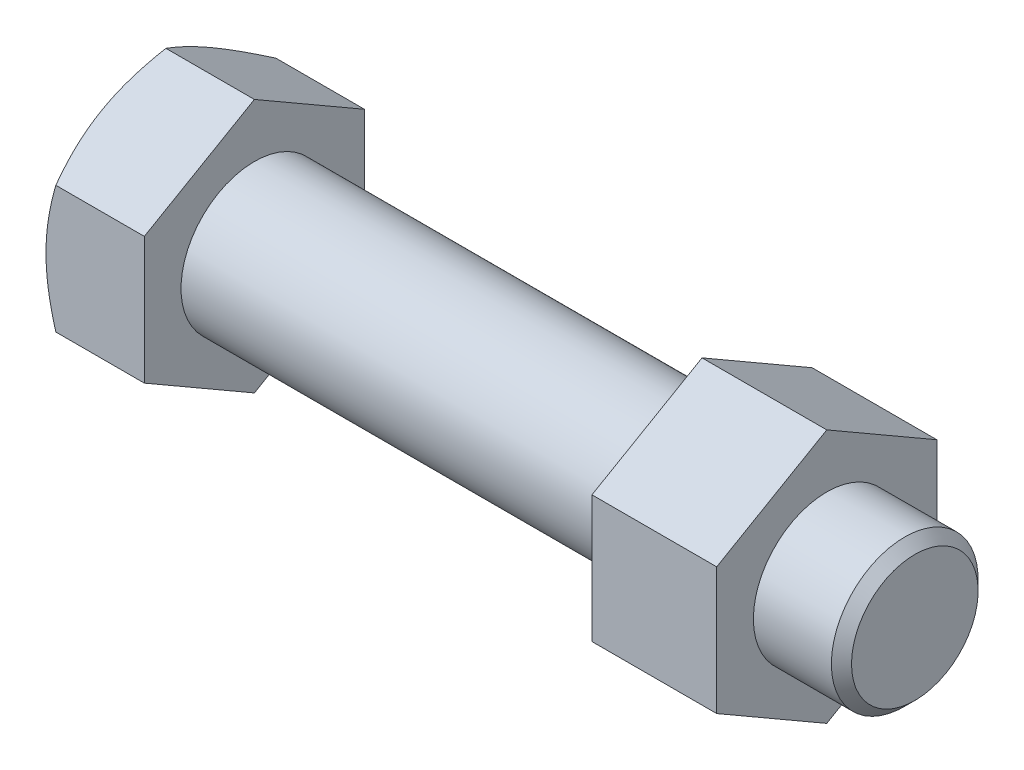
ISO-10303-21;
HEADER;
FILE_DESCRIPTION(('STEP AP214'),'2;1');
FILE_NAME('part.step','',(''),(''),'','','');
FILE_SCHEMA(('AUTOMOTIVE_DESIGN { 1 0 10303 214 1 1 1 1 }'));
ENDSEC;
DATA;
#1=APPLICATION_CONTEXT('core data for automotive mechanical design processes');
#2=APPLICATION_PROTOCOL_DEFINITION('international standard','automotive_design',2000,#1);
#3=PRODUCT_CONTEXT('',#1,'mechanical');
#4=PRODUCT('Part','Part','',(#3));
#5=PRODUCT_RELATED_PRODUCT_CATEGORY('part','',(#4));
#6=PRODUCT_DEFINITION_FORMATION('','',#4);
#7=PRODUCT_DEFINITION_CONTEXT('part definition',#1,'design');
#8=PRODUCT_DEFINITION('design','',#6,#7);
#9=PRODUCT_DEFINITION_SHAPE('','',#8);
#10=(LENGTH_UNIT() NAMED_UNIT(*) SI_UNIT(.MILLI.,.METRE.));
#11=(NAMED_UNIT(*) PLANE_ANGLE_UNIT() SI_UNIT($,.RADIAN.));
#12=(NAMED_UNIT(*) SI_UNIT($,.STERADIAN.) SOLID_ANGLE_UNIT());
#13=UNCERTAINTY_MEASURE_WITH_UNIT(LENGTH_MEASURE(1.E-05),#10,'distance_accuracy_value','');
#14=(GEOMETRIC_REPRESENTATION_CONTEXT(3) GLOBAL_UNCERTAINTY_ASSIGNED_CONTEXT((#13)) GLOBAL_UNIT_ASSIGNED_CONTEXT((#10,
#11,#12)) REPRESENTATION_CONTEXT('',''));
#15=CARTESIAN_POINT('',(0.,0.,0.));
#16=DIRECTION('',(0.,0.,1.));
#17=DIRECTION('',(1.,0.,0.));
#18=AXIS2_PLACEMENT_3D('',#15,#16,#17);
#19=CARTESIAN_POINT('',(0.,0.,0.));
#20=DIRECTION('',(-1.00000000000002,0.,0.));
#21=DIRECTION('',(0.,0.,1.));
#22=AXIS2_PLACEMENT_3D('',#19,#20,#21);
#23=CYLINDRICAL_SURFACE('',#22,10.);
#24=CARTESIAN_POINT('',(13.3999999999999,0.,0.));
#25=DIRECTION('',(1.00000000000002,0.,0.));
#26=DIRECTION('',(0.,0.,-1.));
#27=AXIS2_PLACEMENT_3D('',#24,#25,#26);
#28=CIRCLE('',#27,10.);
#29=CARTESIAN_POINT('',(13.3999999999999,0.,-10.));
#30=VERTEX_POINT('',#29);
#31=EDGE_CURVE('E280',#30,#30,#28,.F.);
#32=ORIENTED_EDGE('',*,*,#31,.F.);
#33=EDGE_LOOP('',(#32));
#34=FACE_BOUND('',#33,.T.);
#35=CARTESIAN_POINT('',(74.4000000000012,-2.77555756156289E-13,-8.88178419700125E-13));
#36=DIRECTION('',(1.00000000000002,0.,0.));
#37=DIRECTION('',(0.,0.,-1.));
#38=AXIS2_PLACEMENT_3D('',#35,#36,#37);
#39=CIRCLE('',#38,10.);
#40=CARTESIAN_POINT('',(74.4000000000012,-2.77555756156289E-13,-10.0000000000009));
#41=VERTEX_POINT('',#40);
#42=EDGE_CURVE('E11',#41,#41,#39,.T.);
#43=ORIENTED_EDGE('',*,*,#42,.F.);
#44=EDGE_LOOP('',(#43));
#45=FACE_BOUND('',#44,.T.);
#46=ADVANCED_FACE('F38',(#34,#45),#23,.T.);
#47=CARTESIAN_POINT('',(13.4,8.66025403784412,-15.));
#48=DIRECTION('',(0.,-0.866025403784452,0.500000000000001));
#49=DIRECTION('',(0.,-0.500000000000009,-0.866025403784439));
#50=AXIS2_PLACEMENT_3D('',#47,#48,#49);
#51=PLANE('',#50);
#52=CARTESIAN_POINT('',(1.33981262948873,17.3206235457428,0.00019999999800735));
#53=CARTESIAN_POINT('',(1.22992178974348,17.1302745659124,-0.329494104235239));
#54=CARTESIAN_POINT('',(1.12501758932805,16.9391831227811,-0.660474192629516));
#55=CARTESIAN_POINT('',(0.926568581942497,16.555467907948,-1.32508844035708));
#56=CARTESIAN_POINT('',(0.833027511048935,16.3628436543351,-1.65872343438493));
#57=CARTESIAN_POINT('',(0.65856214760936,15.9756905506614,-2.32929228025591));
#58=CARTESIAN_POINT('',(0.577667706601698,15.7811583127501,-2.66623200002818));
#59=CARTESIAN_POINT('',(0.430232643421587,15.3907420734243,-3.34245276264056));
#60=CARTESIAN_POINT('',(0.363691202380892,15.1948581497844,-3.6817336707707));
#61=CARTESIAN_POINT('',(0.247792374695921,14.8067578304056,-4.3539431423685));
#62=CARTESIAN_POINT('',(0.198051383436304,14.6145702475678,-4.68682180042751));
#63=CARTESIAN_POINT('',(0.114646749003283,14.2293144416645,-5.3541044301629));
#64=CARTESIAN_POINT('',(0.0809834152897755,14.0362462017207,-5.68850843107375));
#65=CARTESIAN_POINT('',(0.0305840757078476,13.6497853945781,-6.35787818417828));
#66=CARTESIAN_POINT('',(0.0138279549578747,13.4563934876185,-6.69284279280431));
#67=CARTESIAN_POINT('',(-0.00239660617324882,13.0694311550718,-7.36308121339242));
#68=CARTESIAN_POINT('',(-0.00186558072791873,12.8758607351856,-7.69835501548029));
#69=CARTESIAN_POINT('',(0.0152766129978911,12.5139822792563,-8.32514688731409));
#70=CARTESIAN_POINT('',(0.0297968460488745,12.3456484541469,-8.61670962503368));
#71=CARTESIAN_POINT('',(0.0716371404223871,12.0093680110849,-9.19916443800721));
#72=CARTESIAN_POINT('',(0.098958107109431,11.8414214213649,-9.49005646436071));
#73=CARTESIAN_POINT('',(0.165923511998852,11.5060066717816,-10.0710118522474));
#74=CARTESIAN_POINT('',(0.205578128270624,11.3385390227663,-10.3610743289659));
#75=CARTESIAN_POINT('',(0.296515103017877,11.0043888432036,-10.9398394173266));
#76=CARTESIAN_POINT('',(0.34779825196923,10.8377063668168,-11.2285419351601));
#77=CARTESIAN_POINT('',(0.520386864747077,10.3317324659526,-12.1049144387608));
#78=CARTESIAN_POINT('',(0.658901178256902,9.99390625558979,-12.6900465992375));
#79=CARTESIAN_POINT('',(0.973271968475103,9.3232912218448,-13.8515859100034));
#80=CARTESIAN_POINT('',(1.14905461461768,8.99049381241376,-14.4280079317654));
#81=CARTESIAN_POINT('',(1.33981262948857,8.66013856779058,-15.0002));
#82=B_SPLINE_CURVE_WITH_KNOTS('',3,(#52,#53,#54,#55,#56,#57,#58,#59,#60,#61,#62,#63,#64,#65,#66,
#67,#68,#69,#70,#71,#72,#73,#74,#75,#76,#77,#78,#79,#80,#81),.UNSPECIFIED.,.F.,.F.,(4,2,2,2,2,2,
2,2,2,2,2,2,2,2,4),(0.,1.18875411504163,2.37789802800057,3.56980778300395,4.76164951910137,
5.92407379683758,7.08652044780811,8.24758247406076,9.40860862348372,10.4193068498564,
11.4300765712307,12.4416826308647,13.45335747734,15.5211962051173,17.5849760846225),.UNSPECIFIED.);
#83=CARTESIAN_POINT('',(1.3397459621553,17.320508075689,-1.99840144432528E-12));
#84=VERTEX_POINT('',#83);
#85=CARTESIAN_POINT('',(-2.77555756156289E-13,12.9903810567667,-7.50000000000195));
#86=VERTEX_POINT('',#85);
#87=EDGE_CURVE('E55',#84,#86,#82,.T.);
#88=ORIENTED_EDGE('',*,*,#87,.F.);
#89=DIRECTION('',(-1.00000000000002,0.,0.));
#90=VECTOR('',#89,1.);
#91=CARTESIAN_POINT('',(13.4000000000001,17.3205080756892,-8.88178419700125E-13));
#92=LINE('',#91,#90);
#93=CARTESIAN_POINT('',(13.4000000000001,17.3205080756892,-8.88178419700125E-13));
#94=VERTEX_POINT('',#93);
#95=EDGE_CURVE('E316',#94,#84,#92,.T.);
#96=ORIENTED_EDGE('',*,*,#95,.F.);
#97=DIRECTION('',(0.,0.500000000000009,0.866025403784439));
#98=VECTOR('',#97,1.);
#99=CARTESIAN_POINT('',(13.4,8.66025403784412,-15.));
#100=LINE('',#99,#98);
#101=CARTESIAN_POINT('',(13.4,8.66025403784412,-15.));
#102=VERTEX_POINT('',#101);
#103=EDGE_CURVE('E284',#102,#94,#100,.T.);
#104=ORIENTED_EDGE('',*,*,#103,.F.);
#105=DIRECTION('',(-1.00000000000002,0.,0.));
#106=VECTOR('',#105,1.);
#107=CARTESIAN_POINT('',(13.4,8.66025403784412,-15.));
#108=LINE('',#107,#106);
#109=CARTESIAN_POINT('',(1.33974596215508,8.66025403784407,-15.));
#110=VERTEX_POINT('',#109);
#111=EDGE_CURVE('E301',#102,#110,#108,.T.);
#112=ORIENTED_EDGE('',*,*,#111,.T.);
#113=EDGE_CURVE('E232',#86,#110,#82,.T.);
#114=ORIENTED_EDGE('',*,*,#113,.F.);
#115=EDGE_LOOP('',(#88,#96,#104,#112,#114));
#116=FACE_BOUND('',#115,.T.);
#117=ADVANCED_FACE('F40',(#116),#51,.F.);
#118=CARTESIAN_POINT('',(13.4000000000001,17.3205080756892,-8.88178419700125E-13));
#119=DIRECTION('',(0.,-0.866025403784453,-0.500000000000001));
#120=DIRECTION('',(0.,0.500000000000009,-0.866025403784437));
#121=AXIS2_PLACEMENT_3D('',#118,#119,#120);
#122=PLANE('',#121);
#123=CARTESIAN_POINT('',(1.33981262948896,8.66013856779052,15.0002));
#124=CARTESIAN_POINT('',(1.22992178974392,8.85048754762018,14.6705058957662));
#125=CARTESIAN_POINT('',(1.12501758932857,9.04157899075119,14.3395258073716));
#126=CARTESIAN_POINT('',(0.926568581943023,9.42529420558412,13.6749115596438));
#127=CARTESIAN_POINT('',(0.833027511049402,9.61791845919717,13.3412765656159));
#128=CARTESIAN_POINT('',(0.658562147609746,10.005071562871,12.6707077197449));
#129=CARTESIAN_POINT('',(0.577667706602063,10.1996038007822,12.3337679999725));
#130=CARTESIAN_POINT('',(0.430232643421904,10.5900200401082,11.65754723736));
#131=CARTESIAN_POINT('',(0.363691202381182,10.7859039637481,11.3182663292298));
#132=CARTESIAN_POINT('',(0.247792374696166,11.1740042831269,10.6460568576319));
#133=CARTESIAN_POINT('',(0.198051383436529,11.3661918659648,10.3131781995728));
#134=CARTESIAN_POINT('',(0.114646749003475,11.7514476718682,9.64589556983727));
#135=CARTESIAN_POINT('',(0.080983415289952,11.9445159118121,9.31149156892638));
#136=CARTESIAN_POINT('',(0.0305840757080082,12.3309767189546,8.64212181582165));
#137=CARTESIAN_POINT('',(0.013827954958034,12.5243686259142,8.30715720719548));
#138=CARTESIAN_POINT('',(-0.0023966061731166,12.9113309584613,7.63691878660745));
#139=CARTESIAN_POINT('',(-0.00186558072781227,13.1049013783481,7.30164498451981));
#140=CARTESIAN_POINT('',(0.0152766129980061,13.4667798342774,6.67485311268585));
#141=CARTESIAN_POINT('',(0.0297968460490164,13.6351136593863,6.38329037496594));
#142=CARTESIAN_POINT('',(0.0716371404225588,13.9713941024481,5.80083556199211));
#143=CARTESIAN_POINT('',(0.0989581071096056,14.1393406921682,5.50994353563862));
#144=CARTESIAN_POINT('',(0.165923511999046,14.4747554417517,4.92898814775182));
#145=CARTESIAN_POINT('',(0.205578128270834,14.642223090767,4.63892567103328));
#146=CARTESIAN_POINT('',(0.296515103018119,14.9763732703297,4.06016058267244));
#147=CARTESIAN_POINT('',(0.347798251969485,15.1430557467165,3.77145806483894));
#148=CARTESIAN_POINT('',(0.520386864747399,15.6490296475809,2.89508556123806));
#149=CARTESIAN_POINT('',(0.658901178257301,15.9868558579438,2.30995340076125));
#150=CARTESIAN_POINT('',(0.973271968475528,16.6574708916888,1.14841408999506));
#151=CARTESIAN_POINT('',(1.14905461461805,16.9902683011198,0.571992068232898));
#152=CARTESIAN_POINT('',(1.33981262948873,17.3206235457428,-0.000200000002004153));
#153=B_SPLINE_CURVE_WITH_KNOTS('',3,(#123,#124,#125,#126,#127,#128,#129,#130,#131,#132,#133,
#134,#135,#136,#137,#138,#139,#140,#141,#142,#143,#144,#145,#146,#147,#148,#149,#150,#151,#152),
.UNSPECIFIED.,.F.,.F.,(4,2,2,2,2,2,2,2,2,2,2,2,2,2,4),(0.,1.18875411504184,2.377898028001,
3.56980778300462,4.76164951910227,5.92407379683872,7.08652044780948,8.24758247406236,
9.40860862348555,10.4193068498584,11.430076571233,12.4416826308671,13.4533574773426,
15.5211962051203,17.5849760846259),.UNSPECIFIED.);
#154=CARTESIAN_POINT('',(1.33974596215514,8.66025403784423,15.));
#155=VERTEX_POINT('',#154);
#156=CARTESIAN_POINT('',(-5.55111512312578E-13,12.9903810567667,7.49999999999806));
#157=VERTEX_POINT('',#156);
#158=EDGE_CURVE('E63',#155,#157,#153,.T.);
#159=ORIENTED_EDGE('',*,*,#158,.F.);
#160=DIRECTION('',(-1.00000000000002,0.,0.));
#161=VECTOR('',#160,1.);
#162=CARTESIAN_POINT('',(13.4000000000001,8.66025403784418,15.));
#163=LINE('',#162,#161);
#164=CARTESIAN_POINT('',(13.4000000000001,8.66025403784418,15.));
#165=VERTEX_POINT('',#164);
#166=EDGE_CURVE('E313',#165,#155,#163,.T.);
#167=ORIENTED_EDGE('',*,*,#166,.F.);
#168=DIRECTION('',(0.,-0.500000000000009,0.866025403784437));
#169=VECTOR('',#168,1.);
#170=CARTESIAN_POINT('',(13.4000000000001,17.3205080756892,-8.88178419700125E-13));
#171=LINE('',#170,#169);
#172=EDGE_CURVE('E291',#94,#165,#171,.T.);
#173=ORIENTED_EDGE('',*,*,#172,.F.);
#174=ORIENTED_EDGE('',*,*,#95,.T.);
#175=EDGE_CURVE('E229',#157,#84,#153,.T.);
#176=ORIENTED_EDGE('',*,*,#175,.F.);
#177=EDGE_LOOP('',(#159,#167,#173,#174,#176));
#178=FACE_BOUND('',#177,.T.);
#179=ADVANCED_FACE('F248',(#178),#122,.F.);
#180=CARTESIAN_POINT('',(13.4000000000001,8.66025403784418,15.));
#181=DIRECTION('',(0.,0.,-1.));
#182=DIRECTION('',(-1.00000000000002,0.,0.));
#183=AXIS2_PLACEMENT_3D('',#180,#181,#182);
#184=PLANE('',#183);
#185=CARTESIAN_POINT('',(7.37312634053044,-23.3710902414284,14.9999999999991));
#186=CARTESIAN_POINT('',(7.21375262152394,-23.0430760678907,14.9999999999997));
#187=CARTESIAN_POINT('',(7.05516543980375,-22.7146799160135,14.9999999999999));
#188=CARTESIAN_POINT('',(6.73974206910431,-22.0570439843207,15.0000000000001));
#189=CARTESIAN_POINT('',(6.58290589740285,-21.7278041962201,15.));
#190=CARTESIAN_POINT('',(6.11525014240073,-20.7386136963543,15.));
#191=CARTESIAN_POINT('',(5.80732977355137,-20.0772871992672,15.));
#192=CARTESIAN_POINT('',(5.19942692960412,-18.7466975896992,15.));
#193=CARTESIAN_POINT('',(4.89949586067201,-18.0774109356544,15.));
#194=CARTESIAN_POINT('',(4.31175828239418,-16.7335531318994,15.));
#195=CARTESIAN_POINT('',(4.02395120754615,-16.058982230408,15.));
#196=CARTESIAN_POINT('',(3.45448123485132,-14.6812618339699,15.));
#197=CARTESIAN_POINT('',(3.17332879633782,-13.9779002509557,15.));
#198=CARTESIAN_POINT('',(2.63203971808707,-12.5629833856319,15.));
#199=CARTESIAN_POINT('',(2.37190542191477,-11.8514271996862,15.));
#200=CARTESIAN_POINT('',(1.87940642767896,-10.4203092774285,15.));
#201=CARTESIAN_POINT('',(1.64698643343703,-9.70076672295608,15.));
#202=CARTESIAN_POINT('',(1.21728875041644,-8.25129237856235,15.));
#203=CARTESIAN_POINT('',(1.02000010663798,-7.52136390422145,15.));
#204=CARTESIAN_POINT('',(0.758044011051319,-6.42057854312805,15.));
#205=CARTESIAN_POINT('',(0.676568269151068,-6.05369801817344,15.));
#206=CARTESIAN_POINT('',(0.52590126598472,-5.31741005067948,15.));
#207=CARTESIAN_POINT('',(0.45670975758376,-4.94800265913108,15.));
#208=CARTESIAN_POINT('',(0.33182565124081,-4.20690684288101,15.));
#209=CARTESIAN_POINT('',(0.276132866036648,-3.83521844989607,15.));
#210=CARTESIAN_POINT('',(0.179353464528058,-3.08994807492399,15.));
#211=CARTESIAN_POINT('',(0.138266210272095,-2.71636617636594,15.));
#212=CARTESIAN_POINT('',(0.0720349282970266,-1.97275308863414,15.));
#213=CARTESIAN_POINT('',(0.0466876247902534,-1.60274011631239,15.));
#214=CARTESIAN_POINT('',(0.0116690165593621,-0.861974179459457,15.));
#215=CARTESIAN_POINT('',(0.00199744875096211,-0.491221227451833,15.));
#216=CARTESIAN_POINT('',(-0.00143922526235546,0.250361887880086,15.));
#217=CARTESIAN_POINT('',(0.00479570857023899,0.621192051396376,15.));
#218=CARTESIAN_POINT('',(0.0330186069488522,1.36225664168361,15.));
#219=CARTESIAN_POINT('',(0.0550072762399069,1.73249104106033,15.));
#220=CARTESIAN_POINT('',(0.126051291967124,2.61901692241319,15.));
#221=CARTESIAN_POINT('',(0.182399811188445,3.13473445335225,15.));
#222=CARTESIAN_POINT('',(0.322620708610197,4.16241630599115,15.));
#223=CARTESIAN_POINT('',(0.406496739204239,4.67438012042157,15.));
#224=CARTESIAN_POINT('',(0.5987890771624,5.69404144057601,15.));
#225=CARTESIAN_POINT('',(0.707224210739416,6.20173536185449,15.));
#226=CARTESIAN_POINT('',(0.945319561804637,7.21206683232336,15.));
#227=CARTESIAN_POINT('',(1.07497948282558,7.71470445203596,15.));
#228=CARTESIAN_POINT('',(1.3554419725117,8.72602999971816,15.));
#229=CARTESIAN_POINT('',(1.5066497820497,9.23460476162497,15.));
#230=CARTESIAN_POINT('',(1.82490436710143,10.2467458696588,15.));
#231=CARTESIAN_POINT('',(1.99195124812734,10.7503121823972,14.9999999999999));
#232=CARTESIAN_POINT('',(2.33921280433568,11.752681354835,15.0000000000001));
#233=CARTESIAN_POINT('',(2.51942324274078,12.2514856892738,15.0000000000003));
#234=CARTESIAN_POINT('',(2.89087066917173,13.2449469437032,14.9999999999998));
#235=CARTESIAN_POINT('',(3.08210752155879,13.7396039146259,14.999999999999));
#236=CARTESIAN_POINT('',(3.54947439299877,14.9157121538858,14.9999999999987));
#237=CARTESIAN_POINT('',(3.82985053967998,15.5954736257742,14.9999999999997));
#238=CARTESIAN_POINT('',(4.40448813553271,16.9491200475863,15.0000000000004));
#239=CARTESIAN_POINT('',(4.69875048752327,17.6230046120358,15.0000000000001));
#240=CARTESIAN_POINT('',(5.29835231295368,18.9660045563955,14.9999999999999));
#241=CARTESIAN_POINT('',(5.60369438024245,19.6351187750883,15.));
#242=CARTESIAN_POINT('',(6.22319663096822,20.9692236108889,15.));
#243=CARTESIAN_POINT('',(6.53735661507852,21.6342143207933,15.));
#244=CARTESIAN_POINT('',(7.1731911970716,22.9615174098261,15.));
#245=CARTESIAN_POINT('',(7.49487393606521,23.6238258820832,15.));
#246=CARTESIAN_POINT('',(8.14411318318144,24.9455571746816,15.));
#247=CARTESIAN_POINT('',(8.47166971805682,25.6049799818627,15.));
#248=CARTESIAN_POINT('',(9.13159579124993,26.9212980535411,15.));
#249=CARTESIAN_POINT('',(9.46396466906471,27.5781936495281,15.));
#250=CARTESIAN_POINT('',(10.1327647289833,28.8899147664245,15.));
#251=CARTESIAN_POINT('',(10.4691959273165,29.5447402790506,15.));
#252=CARTESIAN_POINT('',(11.4259204894655,31.395022717977,15.));
#253=CARTESIAN_POINT('',(12.0502117945665,32.5884123624249,15.));
#254=CARTESIAN_POINT('',(13.3073006196976,34.9707491094844,15.));
#255=CARTESIAN_POINT('',(13.9400984560096,36.1596960447989,15.0000000000001));
#256=CARTESIAN_POINT('',(15.2105565660845,38.5310463566275,14.9999999999999));
#257=CARTESIAN_POINT('',(15.8482001148673,39.7134586997755,14.9999999999997));
#258=CARTESIAN_POINT('',(16.8084387500318,41.4849860590738,15.0000000000002));
#259=CARTESIAN_POINT('',(17.1291381438991,42.0751301506581,15.0000000000004));
#260=CARTESIAN_POINT('',(17.7716684878247,43.2548008777473,14.9999999999996));
#261=CARTESIAN_POINT('',(18.0934994361269,43.8443275142086,14.9999999999986));
#262=CARTESIAN_POINT('',(18.4158306344158,44.4335805842636,14.9999999999961));
#263=B_SPLINE_CURVE_WITH_KNOTS('',3,(#185,#186,#187,#188,#189,#190,#191,#192,#193,#194,#195,
#196,#197,#198,#199,#200,#201,#202,#203,#204,#205,#206,#207,#208,#209,#210,#211,#212,#213,#214,
#215,#216,#217,#218,#219,#220,#221,#222,#223,#224,#225,#226,#227,#228,#229,#230,#231,#232,#233,
#234,#235,#236,#237,#238,#239,#240,#241,#242,#243,#244,#245,#246,#247,#248,#249,#250,#251,#252,
#253,#254,#255,#256,#257,#258,#259,#260,#261,#262),.UNSPECIFIED.,.F.,.F.,(4,2,2,2,2,2,2,2,2,2,2,
2,2,2,2,2,2,2,2,2,2,2,2,2,2,2,2,2,2,2,2,2,2,2,2,2,2,2,4),(0.,1.09404536545602,2.18810151669501,
4.37653199497436,6.5766949191379,8.77675510670049,11.0489153517508,13.3213285985887,
15.5891291968651,17.8562213843688,18.9835047903025,20.1107655149184,21.2380106006198,
22.3652064435979,23.4775244969861,24.5898238822599,25.7021260672532,26.8144780143107,
28.3699800813123,29.9256886182749,31.4825937717553,33.0394771802817,34.6309007054008,
36.2223348325516,37.8132589841613,39.404163569572,41.6098943752717,43.8157687858483,
46.0221629836909,48.2285073466734,50.4373613391624,52.6462253946457,54.8547891004884,
57.0633616326601,61.1037632903615,65.1443155923799,69.174459313979,71.1894182888214,
73.204374137988),.UNSPECIFIED.);
#264=CARTESIAN_POINT('',(1.33974596215558,-8.6602540378449,15.));
#265=VERTEX_POINT('',#264);
#266=CARTESIAN_POINT('',(-1.11022302462516E-13,-3.33066907387547E-13,15.));
#267=VERTEX_POINT('',#266);
#268=EDGE_CURVE('E287',#265,#267,#263,.T.);
#269=ORIENTED_EDGE('',*,*,#268,.F.);
#270=DIRECTION('',(-1.00000000000002,0.,0.));
#271=VECTOR('',#270,1.);
#272=CARTESIAN_POINT('',(13.3999999999999,-8.66025403784484,15.));
#273=LINE('',#272,#271);
#274=CARTESIAN_POINT('',(13.3999999999999,-8.66025403784484,15.));
#275=VERTEX_POINT('',#274);
#276=EDGE_CURVE('E310',#275,#265,#273,.T.);
#277=ORIENTED_EDGE('',*,*,#276,.F.);
#278=DIRECTION('',(0.,-1.00000000000002,0.));
#279=VECTOR('',#278,1.);
#280=CARTESIAN_POINT('',(13.4000000000001,8.66025403784418,15.));
#281=LINE('',#280,#279);
#282=EDGE_CURVE('E293',#165,#275,#281,.T.);
#283=ORIENTED_EDGE('',*,*,#282,.F.);
#284=ORIENTED_EDGE('',*,*,#166,.T.);
#285=EDGE_CURVE('E242',#267,#155,#263,.T.);
#286=ORIENTED_EDGE('',*,*,#285,.F.);
#287=EDGE_LOOP('',(#269,#277,#283,#284,#286));
#288=FACE_BOUND('',#287,.T.);
#289=ADVANCED_FACE('F219',(#288),#184,.F.);
#290=CARTESIAN_POINT('',(13.3999999999996,-17.3205080756891,1.11022302462516E-12));
#291=DIRECTION('',(0.,0.866025403784452,-0.500000000000001));
#292=DIRECTION('',(0.,0.500000000000009,0.866025403784439));
#293=AXIS2_PLACEMENT_3D('',#290,#291,#292);
#294=PLANE('',#293);
#295=CARTESIAN_POINT('',(1.33981262948879,-17.3206235457429,-0.000200000002004153));
#296=CARTESIAN_POINT('',(1.22992178974444,-17.1302745659141,0.32949410423248));
#297=CARTESIAN_POINT('',(1.12501758932938,-16.9391831227835,0.660474192627264));
#298=CARTESIAN_POINT('',(0.926568581944046,-16.5554679079508,1.3250884403552));
#299=CARTESIAN_POINT('',(0.833027511050349,-16.3628436543377,1.65872343438293));
#300=CARTESIAN_POINT('',(0.658562147610629,-15.9756905506639,2.32929228025385));
#301=CARTESIAN_POINT('',(0.577667706602957,-15.7811583127527,2.6662320000262));
#302=CARTESIAN_POINT('',(0.430232643422786,-15.3907420734268,3.34245276263866));
#303=CARTESIAN_POINT('',(0.363691202382041,-15.1948581497869,3.68173367076883));
#304=CARTESIAN_POINT('',(0.247792374696994,-14.8067578304081,4.3539431423667));
#305=CARTESIAN_POINT('',(0.198051383437349,-14.6145702475702,4.68682180042576));
#306=CARTESIAN_POINT('',(0.114646749004226,-14.2293144416669,5.35410443016116));
#307=CARTESIAN_POINT('',(0.080983415290643,-14.0362462017229,5.68850843107196));
#308=CARTESIAN_POINT('',(0.0305840757087384,-13.6497853945806,6.35787818417676));
#309=CARTESIAN_POINT('',(0.0138279549588632,-13.4563934876215,6.69284279280309));
#310=CARTESIAN_POINT('',(-0.00239660617270759,-13.0694311550734,7.36308121339047));
#311=CARTESIAN_POINT('',(-0.00186558072792267,-12.8758607351854,7.69835501547731));
#312=CARTESIAN_POINT('',(0.0152766129978961,-12.5139822792563,8.32514688731134));
#313=CARTESIAN_POINT('',(0.0297968460493032,-12.3456484541485,8.61670962503194));
#314=CARTESIAN_POINT('',(0.0716371404230966,-12.0093680110876,9.19916443800629));
#315=CARTESIAN_POINT('',(0.0989581071099981,-11.8414214213672,9.49005646435963));
#316=CARTESIAN_POINT('',(0.165923511999296,-11.5060066717834,10.0710118522463));
#317=CARTESIAN_POINT('',(0.205578128271086,-11.3385390227682,10.361074328965));
#318=CARTESIAN_POINT('',(0.296515103018344,-11.0043888432055,10.9398394173259));
#319=CARTESIAN_POINT('',(0.347798251969681,-10.8377063668186,11.2285419351594));
#320=CARTESIAN_POINT('',(0.520386864747516,-10.3317324659542,12.1049144387604));
#321=CARTESIAN_POINT('',(0.658901178257379,-9.99390625559138,12.6900465992374));
#322=CARTESIAN_POINT('',(0.973271968475577,-9.32329122184606,13.8515859100035));
#323=CARTESIAN_POINT('',(1.14905461461811,-8.99049381241472,14.4280079317656));
#324=CARTESIAN_POINT('',(1.33981262948885,-8.66013856779083,15.0002));
#325=B_SPLINE_CURVE_WITH_KNOTS('',3,(#295,#296,#297,#298,#299,#300,#301,#302,#303,#304,#305,
#306,#307,#308,#309,#310,#311,#312,#313,#314,#315,#316,#317,#318,#319,#320,#321,#322,#323,#324),
.UNSPECIFIED.,.F.,.F.,(4,2,2,2,2,2,2,2,2,2,2,2,2,2,4),(0.,1.18875411504165,2.37789802800064,
3.56980778300416,4.76164951910172,5.92407379683804,7.08652044780869,8.24758247406143,
9.40860862348445,10.4193068498573,11.430076571232,12.4416826308662,13.4533574773418,
15.5211962051197,17.5849760846255),.UNSPECIFIED.);
#326=CARTESIAN_POINT('',(1.33974596215525,-17.3205080756893,-1.99840144432528E-12));
#327=VERTEX_POINT('',#326);
#328=CARTESIAN_POINT('',(-1.11022302462516E-13,-12.9903810567668,7.49999999999906));
#329=VERTEX_POINT('',#328);
#330=EDGE_CURVE('E223',#327,#329,#325,.T.);
#331=ORIENTED_EDGE('',*,*,#330,.F.);
#332=DIRECTION('',(-1.00000000000002,0.,0.));
#333=VECTOR('',#332,1.);
#334=CARTESIAN_POINT('',(13.3999999999996,-17.3205080756891,1.11022302462516E-12));
#335=LINE('',#334,#333);
#336=CARTESIAN_POINT('',(13.3999999999996,-17.3205080756891,1.11022302462516E-12));
#337=VERTEX_POINT('',#336);
#338=EDGE_CURVE('E307',#337,#327,#335,.T.);
#339=ORIENTED_EDGE('',*,*,#338,.F.);
#340=DIRECTION('',(0.,-0.500000000000009,-0.866025403784439));
#341=VECTOR('',#340,1.);
#342=CARTESIAN_POINT('',(13.3999999999996,-17.3205080756891,1.11022302462516E-12));
#343=LINE('',#342,#341);
#344=EDGE_CURVE('E295',#275,#337,#343,.T.);
#345=ORIENTED_EDGE('',*,*,#344,.F.);
#346=ORIENTED_EDGE('',*,*,#276,.T.);
#347=EDGE_CURVE('E231',#329,#265,#325,.T.);
#348=ORIENTED_EDGE('',*,*,#347,.F.);
#349=EDGE_LOOP('',(#331,#339,#345,#346,#348));
#350=FACE_BOUND('',#349,.T.);
#351=ADVANCED_FACE('F214',(#350),#294,.F.);
#352=CARTESIAN_POINT('',(13.4,-8.66025403784496,-15.));
#353=DIRECTION('',(0.,0.866025403784453,0.500000000000001));
#354=DIRECTION('',(0.,-0.500000000000009,0.866025403784437));
#355=AXIS2_PLACEMENT_3D('',#352,#353,#354);
#356=PLANE('',#355);
#357=CARTESIAN_POINT('',(1.33981262948846,-8.66013856779096,-15.0002));
#358=CARTESIAN_POINT('',(1.22992178974386,-8.85048754762067,-14.6705058957662));
#359=CARTESIAN_POINT('',(1.12501758932871,-9.04157899075166,-14.3395258073717));
#360=CARTESIAN_POINT('',(0.926568581943359,-9.4252942055845,-13.6749115596441));
#361=CARTESIAN_POINT('',(0.833027511049723,-9.61791845919748,-13.3412765656163));
#362=CARTESIAN_POINT('',(0.658562147610083,-10.0050715628712,-12.6707077197455));
#363=CARTESIAN_POINT('',(0.577667706602431,-10.1996038007824,-12.3337679999732));
#364=CARTESIAN_POINT('',(0.430232643422309,-10.5900200401082,-11.6575472373609));
#365=CARTESIAN_POINT('',(0.363691202381592,-10.785903963748,-11.3182663292308));
#366=CARTESIAN_POINT('',(0.24779237469659,-11.1740042831268,-10.6460568576331));
#367=CARTESIAN_POINT('',(0.198051383436961,-11.3661918659646,-10.3131781995741));
#368=CARTESIAN_POINT('',(0.114646749003882,-11.7514476718679,-9.64589556983878));
#369=CARTESIAN_POINT('',(0.0809834152903257,-11.9445159118118,-9.31149156892802));
#370=CARTESIAN_POINT('',(0.0305840757084084,-12.3309767189541,-8.64212181582341));
#371=CARTESIAN_POINT('',(0.0138279549584935,-12.5243686259133,-8.30715720719723));
#372=CARTESIAN_POINT('',(-0.00239660617293292,-12.9113309584609,-7.63691878660973));
#373=CARTESIAN_POINT('',(-0.00186558072796397,-13.1049013783484,-7.30164498452262));
#374=CARTESIAN_POINT('',(0.0152766129978281,-13.4667798342775,-6.67485311268875));
#375=CARTESIAN_POINT('',(0.0297968460490722,-13.6351136593857,-6.3832903749685));
#376=CARTESIAN_POINT('',(0.0716371404227402,-13.9713941024469,-5.80083556199447));
#377=CARTESIAN_POINT('',(0.0989581071096791,-14.1393406921672,-5.50994353564111));
#378=CARTESIAN_POINT('',(0.165923511998991,-14.4747554417508,-4.92898814775445));
#379=CARTESIAN_POINT('',(0.205578128270757,-14.642223090766,-4.63892567103592));
#380=CARTESIAN_POINT('',(0.296515103017981,-14.9763732703287,-4.06016058267512));
#381=CARTESIAN_POINT('',(0.347798251969308,-15.1430557467155,-3.77145806484166));
#382=CARTESIAN_POINT('',(0.520386864747077,-15.6490296475798,-2.89508556124084));
#383=CARTESIAN_POINT('',(0.658901178256849,-15.9868558579426,-2.309953400764));
#384=CARTESIAN_POINT('',(0.973271968475064,-16.6574708916878,-1.14841408999809));
#385=CARTESIAN_POINT('',(1.14905461461771,-16.9902683011191,-0.571992068236214));
#386=CARTESIAN_POINT('',(1.33981262948879,-17.3206235457429,0.00019999999800735));
#387=B_SPLINE_CURVE_WITH_KNOTS('',3,(#357,#358,#359,#360,#361,#362,#363,#364,#365,#366,#367,
#368,#369,#370,#371,#372,#373,#374,#375,#376,#377,#378,#379,#380,#381,#382,#383,#384,#385,#386),
.UNSPECIFIED.,.F.,.F.,(4,2,2,2,2,2,2,2,2,2,2,2,2,2,4),(0.,1.18875411504146,2.37789802800025,
3.56980778300354,4.76164951910085,5.92407379683695,7.08652044780738,8.2475824740599,
9.40860862348272,10.4193068498554,11.4300765712299,12.4416826308639,13.4533574773392,
15.5211962051168,17.5849760846221),.UNSPECIFIED.);
#388=CARTESIAN_POINT('',(1.33974596215514,-8.66025403784493,-15.));
#389=VERTEX_POINT('',#388);
#390=CARTESIAN_POINT('',(-4.44089209850063E-13,-12.9903810567668,-7.50000000000095));
#391=VERTEX_POINT('',#390);
#392=EDGE_CURVE('E191',#389,#391,#387,.T.);
#393=ORIENTED_EDGE('',*,*,#392,.F.);
#394=DIRECTION('',(-1.00000000000002,0.,0.));
#395=VECTOR('',#394,1.);
#396=CARTESIAN_POINT('',(13.4,-8.66025403784496,-15.));
#397=LINE('',#396,#395);
#398=CARTESIAN_POINT('',(13.4,-8.66025403784496,-15.));
#399=VERTEX_POINT('',#398);
#400=EDGE_CURVE('E304',#399,#389,#397,.T.);
#401=ORIENTED_EDGE('',*,*,#400,.F.);
#402=DIRECTION('',(0.,0.500000000000009,-0.866025403784437));
#403=VECTOR('',#402,1.);
#404=CARTESIAN_POINT('',(13.4,-8.66025403784496,-15.));
#405=LINE('',#404,#403);
#406=EDGE_CURVE('E297',#337,#399,#405,.T.);
#407=ORIENTED_EDGE('',*,*,#406,.F.);
#408=ORIENTED_EDGE('',*,*,#338,.T.);
#409=EDGE_CURVE('E230',#391,#327,#387,.T.);
#410=ORIENTED_EDGE('',*,*,#409,.F.);
#411=EDGE_LOOP('',(#393,#401,#407,#408,#410));
#412=FACE_BOUND('',#411,.T.);
#413=ADVANCED_FACE('F207',(#412),#356,.F.);
#414=CARTESIAN_POINT('',(13.4,8.66025403784412,-15.));
#415=DIRECTION('',(0.,0.,1.));
#416=DIRECTION('',(0.,-1.00000000000002,0.));
#417=AXIS2_PLACEMENT_3D('',#414,#415,#416);
#418=PLANE('',#417);
#419=CARTESIAN_POINT('',(7.37312634142245,-23.371090243265,-15.0000000000009));
#420=CARTESIAN_POINT('',(7.21375262239751,-23.0430760696964,-15.0000000000003));
#421=CARTESIAN_POINT('',(7.05516544065876,-22.7146799177882,-15.0000000000001));
#422=CARTESIAN_POINT('',(6.73974206992214,-22.0570439860337,-14.9999999999999));
#423=CARTESIAN_POINT('',(6.58290589820205,-21.7278041979022,-15.));
#424=CARTESIAN_POINT('',(6.11525014314415,-20.7386136979436,-15.0000000000001));
#425=CARTESIAN_POINT('',(5.80732977425772,-20.0772872007946,-15.));
#426=CARTESIAN_POINT('',(5.19942693023628,-18.7466975911017,-15.));
#427=CARTESIAN_POINT('',(4.89949586126706,-18.077410936994,-15.));
#428=CARTESIAN_POINT('',(4.31175828291563,-16.7335531331127,-15.));
#429=CARTESIAN_POINT('',(4.02395120803111,-16.058982231558,-15.));
#430=CARTESIAN_POINT('',(3.4544812352623,-14.6812618349883,-15.));
#431=CARTESIAN_POINT('',(3.1733287967114,-13.9779002519059,-15.));
#432=CARTESIAN_POINT('',(2.63203971838785,-12.5629833864445,-15.));
#433=CARTESIAN_POINT('',(2.37190542218016,-11.8514272004295,-15.));
#434=CARTESIAN_POINT('',(1.87940642787699,-10.4203092780318,-15.));
#435=CARTESIAN_POINT('',(1.6469864336031,-9.70076672348877,-15.));
#436=CARTESIAN_POINT('',(1.21728875052377,-8.25129237895186,-15.));
#437=CARTESIAN_POINT('',(1.02000010671853,-7.52136390453841,-15.));
#438=CARTESIAN_POINT('',(0.758044011093621,-6.42057854331685,-15.));
#439=CARTESIAN_POINT('',(0.676568269179374,-6.05369801830735,-15.));
#440=CARTESIAN_POINT('',(0.525901265988605,-5.31741005070285,-15.));
#441=CARTESIAN_POINT('',(0.456709757577222,-4.9480026590988,-15.));
#442=CARTESIAN_POINT('',(0.33182565121761,-4.20690684273681,-15.));
#443=CARTESIAN_POINT('',(0.276132866007206,-3.83521844969561,-15.));
#444=CARTESIAN_POINT('',(0.179353464490764,-3.08994807461054,-15.));
#445=CARTESIAN_POINT('',(0.138266210233191,-2.71636617599576,-15.));
#446=CARTESIAN_POINT('',(0.0720349282599116,-1.97275308815168,-15.));
#447=CARTESIAN_POINT('',(0.046687624756447,-1.60274011577439,-15.));
#448=CARTESIAN_POINT('',(0.011669016537057,-0.861974178810497,-15.));
#449=CARTESIAN_POINT('',(0.00199744873684967,-0.491221226747452,-15.));
#450=CARTESIAN_POINT('',(-0.00143922525528536,0.250361888694887,-15.));
#451=CARTESIAN_POINT('',(0.00479570859030003,0.621192052266176,-15.));
#452=CARTESIAN_POINT('',(0.033018606999213,1.36225664266268,-15.));
#453=CARTESIAN_POINT('',(0.0550072763075764,1.73249104209367,-15.));
#454=CARTESIAN_POINT('',(0.126051292077544,2.6190169235309,-15.));
#455=CARTESIAN_POINT('',(0.182399811323647,3.13473445449982,-15.));
#456=CARTESIAN_POINT('',(0.322620708796146,4.16241630719712,-15.));
#457=CARTESIAN_POINT('',(0.406496739416152,4.67438012165607,-15.));
#458=CARTESIAN_POINT('',(0.598789077426695,5.69404144186655,-15.));
#459=CARTESIAN_POINT('',(0.707224211030131,6.20173536317253,-15.));
#460=CARTESIAN_POINT('',(0.945319562147931,7.21206683369561,-15.));
#461=CARTESIAN_POINT('',(1.07497948319503,7.71470445343492,-15.));
#462=CARTESIAN_POINT('',(1.35544197293361,8.72603000117125,-15.));
#463=CARTESIAN_POINT('',(1.5066497824979,9.23460476310547,-15.));
#464=CARTESIAN_POINT('',(1.82490436760142,10.2467458711938,-15.));
#465=CARTESIAN_POINT('',(1.9919512486528,10.7503121839594,-15.0000000000001));
#466=CARTESIAN_POINT('',(2.3392128049113,11.7526813564511,-14.9999999999999));
#467=CARTESIAN_POINT('',(2.51942324334108,12.2514856909169,-14.9999999999998));
#468=CARTESIAN_POINT('',(2.89087066982021,13.2449469454002,-15.0000000000003));
#469=CARTESIAN_POINT('',(3.08210752223078,13.7396039163498,-15.000000000001));
#470=CARTESIAN_POINT('',(3.54947439370818,14.9157121556281,-15.0000000000013));
#471=CARTESIAN_POINT('',(3.82985054040196,15.5954736275082,-15.0000000000004));
#472=CARTESIAN_POINT('',(4.40448813627647,16.949120049305,-14.9999999999997));
#473=CARTESIAN_POINT('',(4.69875048827625,17.6230046137474,-14.9999999999999));
#474=CARTESIAN_POINT('',(5.29835231372299,18.9660045580936,-15.0000000000001));
#475=CARTESIAN_POINT('',(5.60369438101888,19.63511877678,-15.));
#476=CARTESIAN_POINT('',(6.22319663175718,20.9692236125684,-15.));
#477=CARTESIAN_POINT('',(6.53735661587289,21.634214322467,-15.));
#478=CARTESIAN_POINT('',(7.17319119787541,22.9615174114885,-15.));
#479=CARTESIAN_POINT('',(7.49487393687304,23.6238258837402,-15.));
#480=CARTESIAN_POINT('',(8.14411318399629,24.9455571763281,-15.));
#481=CARTESIAN_POINT('',(8.47166971887469,25.6049799835041,-15.));
#482=CARTESIAN_POINT('',(9.13159579207307,26.9212980551729,-15.));
#483=CARTESIAN_POINT('',(9.46396466989009,27.5781936511552,-15.));
#484=CARTESIAN_POINT('',(10.1327647298126,28.8899147680427,-15.));
#485=CARTESIAN_POINT('',(10.4691959281474,29.5447402806644,-15.));
#486=CARTESIAN_POINT('',(11.4259204903034,31.3950227195848,-15.));
#487=CARTESIAN_POINT('',(12.0502117954094,32.5884123640315,-15.));
#488=CARTESIAN_POINT('',(13.3073006205491,34.9707491110889,-15.));
#489=CARTESIAN_POINT('',(13.940098456865,36.1596960464026,-14.9999999999999));
#490=CARTESIAN_POINT('',(15.2105565669474,38.5310463582311,-15.0000000000001));
#491=CARTESIAN_POINT('',(15.8482001157339,39.7134587013798,-15.0000000000003));
#492=CARTESIAN_POINT('',(16.8084387509035,41.4849860606792,-14.9999999999999));
#493=CARTESIAN_POINT('',(17.1291381447725,42.075130152264,-14.9999999999996));
#494=CARTESIAN_POINT('',(17.7716684887012,43.2548008793542,-15.0000000000004));
#495=CARTESIAN_POINT('',(18.0934994370049,43.844327515816,-15.0000000000014));
#496=CARTESIAN_POINT('',(18.4158306352953,44.4335805858715,-15.0000000000038));
#497=B_SPLINE_CURVE_WITH_KNOTS('',3,(#419,#420,#421,#422,#423,#424,#425,#426,#427,#428,#429,
#430,#431,#432,#433,#434,#435,#436,#437,#438,#439,#440,#441,#442,#443,#444,#445,#446,#447,#448,
#449,#450,#451,#452,#453,#454,#455,#456,#457,#458,#459,#460,#461,#462,#463,#464,#465,#466,#467,
#468,#469,#470,#471,#472,#473,#474,#475,#476,#477,#478,#479,#480,#481,#482,#483,#484,#485,#486,
#487,#488,#489,#490,#491,#492,#493,#494,#495,#496),.UNSPECIFIED.,.F.,.F.,(4,2,2,2,2,2,2,2,2,2,2,
2,2,2,2,2,2,2,2,2,2,2,2,2,2,2,2,2,2,2,2,2,2,2,2,2,2,2,4),(0.,1.09404536556373,2.18810151691041,
4.3765319954052,6.57669491978653,8.7767551075669,11.0489153528489,13.3213285999186,
15.589129198426,17.8562213861604,18.9835047922639,20.1107655170495,21.2380106029205,
22.3652064460682,23.4775244996217,24.5898238850609,25.7021260702198,26.8144780174427,
28.3699800845414,29.925688621601,31.4825937751787,33.0394771838024,34.6309007090228,
36.2223348362749,37.8132589879857,39.4041635734974,41.6098943791887,43.8157687897569,
46.0221629875908,48.2285073505647,50.4373613430441,52.6462253985179,54.8547891043513,
57.0633616365136,61.1037632942183,65.1443155962401,69.1744593178462,71.1894182926921,
73.2043741418622),.UNSPECIFIED.);
#498=CARTESIAN_POINT('',(-2.22044604925031E-13,-1.38777878078145E-13,-15.));
#499=VERTEX_POINT('',#498);
#500=EDGE_CURVE('E190',#110,#499,#497,.F.);
#501=ORIENTED_EDGE('',*,*,#500,.F.);
#502=ORIENTED_EDGE('',*,*,#111,.F.);
#503=DIRECTION('',(0.,1.00000000000002,0.));
#504=VECTOR('',#503,1.);
#505=CARTESIAN_POINT('',(13.4,8.66025403784412,-15.));
#506=LINE('',#505,#504);
#507=EDGE_CURVE('E299',#399,#102,#506,.T.);
#508=ORIENTED_EDGE('',*,*,#507,.F.);
#509=ORIENTED_EDGE('',*,*,#400,.T.);
#510=EDGE_CURVE('E182',#499,#389,#497,.F.);
#511=ORIENTED_EDGE('',*,*,#510,.F.);
#512=EDGE_LOOP('',(#501,#502,#508,#509,#511));
#513=FACE_BOUND('',#512,.T.);
#514=ADVANCED_FACE('F202',(#513),#418,.F.);
#515=CARTESIAN_POINT('',(13.4000000000001,17.3205080756892,-8.88178419700125E-13));
#516=DIRECTION('',(1.00000000000002,0.,0.));
#517=DIRECTION('',(0.,0.,-1.));
#518=AXIS2_PLACEMENT_3D('',#515,#516,#517);
#519=PLANE('',#518);
#520=ORIENTED_EDGE('',*,*,#31,.T.);
#521=EDGE_LOOP('',(#520));
#522=FACE_BOUND('',#521,.T.);
#523=ORIENTED_EDGE('',*,*,#103,.T.);
#524=ORIENTED_EDGE('',*,*,#172,.T.);
#525=ORIENTED_EDGE('',*,*,#282,.T.);
#526=ORIENTED_EDGE('',*,*,#344,.T.);
#527=ORIENTED_EDGE('',*,*,#406,.T.);
#528=ORIENTED_EDGE('',*,*,#507,.T.);
#529=EDGE_LOOP('',(#523,#524,#525,#526,#527,#528));
#530=FACE_BOUND('',#529,.T.);
#531=ADVANCED_FACE('F206',(#522,#530),#519,.T.);
#532=CARTESIAN_POINT('',(0.,0.,0.));
#533=DIRECTION('',(1.00000000000002,0.,0.));
#534=DIRECTION('',(0.,0.,-1.));
#535=AXIS2_PLACEMENT_3D('',#532,#533,#534);
#536=CONICAL_SURFACE('',#535,15.,1.0471975511966);
#537=ORIENTED_EDGE('',*,*,#392,.T.);
#538=CARTESIAN_POINT('',(0.,0.,0.));
#539=DIRECTION('',(1.00000000000002,0.,0.));
#540=DIRECTION('',(0.,0.,-1.));
#541=AXIS2_PLACEMENT_3D('',#538,#539,#540);
#542=CIRCLE('',#541,15.);
#543=EDGE_CURVE('E319',#391,#499,#542,.T.);
#544=ORIENTED_EDGE('',*,*,#543,.T.);
#545=ORIENTED_EDGE('',*,*,#510,.T.);
#546=EDGE_LOOP('',(#537,#544,#545));
#547=FACE_BOUND('',#546,.T.);
#548=ADVANCED_FACE('F359',(#547),#536,.T.);
#549=ORIENTED_EDGE('',*,*,#330,.T.);
#550=EDGE_CURVE('E321',#329,#391,#542,.T.);
#551=ORIENTED_EDGE('',*,*,#550,.T.);
#552=ORIENTED_EDGE('',*,*,#409,.T.);
#553=EDGE_LOOP('',(#549,#551,#552));
#554=FACE_BOUND('',#553,.T.);
#555=ADVANCED_FACE('F361',(#554),#536,.T.);
#556=ORIENTED_EDGE('',*,*,#268,.T.);
#557=EDGE_CURVE('E326',#267,#329,#542,.T.);
#558=ORIENTED_EDGE('',*,*,#557,.T.);
#559=ORIENTED_EDGE('',*,*,#347,.T.);
#560=EDGE_LOOP('',(#556,#558,#559));
#561=FACE_BOUND('',#560,.T.);
#562=ADVANCED_FACE('F198',(#561),#536,.T.);
#563=ORIENTED_EDGE('',*,*,#285,.T.);
#564=ORIENTED_EDGE('',*,*,#158,.T.);
#565=CARTESIAN_POINT('',(0.,0.,0.));
#566=DIRECTION('',(-1.00000000000002,0.,0.));
#567=DIRECTION('',(0.,0.,1.));
#568=AXIS2_PLACEMENT_3D('',#565,#566,#567);
#569=CIRCLE('',#568,15.);
#570=EDGE_CURVE('E175',#267,#157,#569,.T.);
#571=ORIENTED_EDGE('',*,*,#570,.F.);
#572=EDGE_LOOP('',(#563,#564,#571));
#573=FACE_BOUND('',#572,.T.);
#574=ADVANCED_FACE('F344',(#573),#536,.T.);
#575=ORIENTED_EDGE('',*,*,#175,.T.);
#576=ORIENTED_EDGE('',*,*,#87,.T.);
#577=EDGE_CURVE('E327',#86,#157,#542,.T.);
#578=ORIENTED_EDGE('',*,*,#577,.T.);
#579=EDGE_LOOP('',(#575,#576,#578));
#580=FACE_BOUND('',#579,.T.);
#581=ADVANCED_FACE('F363',(#580),#536,.T.);
#582=ORIENTED_EDGE('',*,*,#113,.T.);
#583=ORIENTED_EDGE('',*,*,#500,.T.);
#584=EDGE_CURVE('E48',#499,#86,#542,.T.);
#585=ORIENTED_EDGE('',*,*,#584,.T.);
#586=EDGE_LOOP('',(#582,#583,#585));
#587=FACE_BOUND('',#586,.T.);
#588=ADVANCED_FACE('F355',(#587),#536,.T.);
#589=CARTESIAN_POINT('',(-2.22044604925031E-13,17.3205080756891,-1.99840144432528E-12));
#590=DIRECTION('',(1.00000000000002,0.,0.));
#591=DIRECTION('',(0.,0.,-1.));
#592=AXIS2_PLACEMENT_3D('',#589,#590,#591);
#593=PLANE('',#592);
#594=ORIENTED_EDGE('',*,*,#584,.F.);
#595=ORIENTED_EDGE('',*,*,#543,.F.);
#596=ORIENTED_EDGE('',*,*,#550,.F.);
#597=ORIENTED_EDGE('',*,*,#557,.F.);
#598=ORIENTED_EDGE('',*,*,#570,.T.);
#599=ORIENTED_EDGE('',*,*,#577,.F.);
#600=EDGE_LOOP('',(#594,#595,#596,#597,#598,#599));
#601=FACE_BOUND('',#600,.T.);
#602=ADVANCED_FACE('F209',(#601),#593,.F.);
#603=CARTESIAN_POINT('',(91.4000000000014,8.6602540378444,-15.000000000001));
#604=DIRECTION('',(0.,-0.866025403784456,0.499999999999996));
#605=DIRECTION('',(0.,-0.500000000000003,-0.866025403784443));
#606=AXIS2_PLACEMENT_3D('',#603,#604,#605);
#607=PLANE('',#606);
#608=DIRECTION('',(0.,0.500000000000003,0.866025403784443));
#609=VECTOR('',#608,1.);
#610=CARTESIAN_POINT('',(74.4000000000011,8.66025403784443,-15.0000000000008));
#611=LINE('',#610,#609);
#612=CARTESIAN_POINT('',(74.4000000000011,8.66025403784443,-15.0000000000008));
#613=VERTEX_POINT('',#612);
#614=CARTESIAN_POINT('',(74.400000000001,17.320508075689,-1.99840144432528E-12));
#615=VERTEX_POINT('',#614);
#616=EDGE_CURVE('E172',#613,#615,#611,.T.);
#617=ORIENTED_EDGE('',*,*,#616,.T.);
#618=DIRECTION('',(-1.00000000000002,0.,0.));
#619=VECTOR('',#618,1.);
#620=CARTESIAN_POINT('',(91.4000000000016,17.3205080756889,0.));
#621=LINE('',#620,#619);
#622=CARTESIAN_POINT('',(91.4000000000016,17.3205080756889,0.));
#623=VERTEX_POINT('',#622);
#624=EDGE_CURVE('E152',#623,#615,#621,.T.);
#625=ORIENTED_EDGE('',*,*,#624,.F.);
#626=DIRECTION('',(0.,0.500000000000003,0.866025403784443));
#627=VECTOR('',#626,1.);
#628=CARTESIAN_POINT('',(91.4000000000014,8.6602540378444,-15.000000000001));
#629=LINE('',#628,#627);
#630=CARTESIAN_POINT('',(91.4000000000014,8.6602540378444,-15.000000000001));
#631=VERTEX_POINT('',#630);
#632=EDGE_CURVE('E159',#631,#623,#629,.T.);
#633=ORIENTED_EDGE('',*,*,#632,.F.);
#634=DIRECTION('',(-1.00000000000002,0.,0.));
#635=VECTOR('',#634,1.);
#636=CARTESIAN_POINT('',(91.4000000000014,8.6602540378444,-15.000000000001));
#637=LINE('',#636,#635);
#638=EDGE_CURVE('E520',#631,#613,#637,.T.);
#639=ORIENTED_EDGE('',*,*,#638,.T.);
#640=EDGE_LOOP('',(#617,#625,#633,#639));
#641=FACE_BOUND('',#640,.T.);
#642=ADVANCED_FACE('F170',(#641),#607,.F.);
#643=CARTESIAN_POINT('',(91.4000000000016,17.3205080756889,0.));
#644=DIRECTION('',(0.,-0.866025403784453,-0.500000000000001));
#645=DIRECTION('',(0.,0.500000000000009,-0.866025403784437));
#646=AXIS2_PLACEMENT_3D('',#643,#644,#645);
#647=PLANE('',#646);
#648=DIRECTION('',(0.,-0.500000000000009,0.866025403784437));
#649=VECTOR('',#648,1.);
#650=CARTESIAN_POINT('',(74.400000000001,17.320508075689,-1.99840144432528E-12));
#651=LINE('',#650,#649);
#652=CARTESIAN_POINT('',(74.4000000000011,8.66025403784434,14.9999999999991));
#653=VERTEX_POINT('',#652);
#654=EDGE_CURVE('E506',#615,#653,#651,.T.);
#655=ORIENTED_EDGE('',*,*,#654,.T.);
#656=DIRECTION('',(-1.00000000000002,0.,0.));
#657=VECTOR('',#656,1.);
#658=CARTESIAN_POINT('',(91.4000000000011,8.66025403784396,14.9999999999989));
#659=LINE('',#658,#657);
#660=CARTESIAN_POINT('',(91.4000000000011,8.66025403784396,14.9999999999989));
#661=VERTEX_POINT('',#660);
#662=EDGE_CURVE('E155',#661,#653,#659,.T.);
#663=ORIENTED_EDGE('',*,*,#662,.F.);
#664=DIRECTION('',(0.,-0.500000000000009,0.866025403784437));
#665=VECTOR('',#664,1.);
#666=CARTESIAN_POINT('',(91.4000000000016,17.3205080756889,0.));
#667=LINE('',#666,#665);
#668=EDGE_CURVE('E148',#623,#661,#667,.T.);
#669=ORIENTED_EDGE('',*,*,#668,.F.);
#670=ORIENTED_EDGE('',*,*,#624,.T.);
#671=EDGE_LOOP('',(#655,#663,#669,#670));
#672=FACE_BOUND('',#671,.T.);
#673=ADVANCED_FACE('F150',(#672),#647,.F.);
#674=CARTESIAN_POINT('',(91.4000000000011,8.66025403784396,14.9999999999989));
#675=DIRECTION('',(0.,0.,-1.));
#676=DIRECTION('',(0.,1.00000000000002,0.));
#677=AXIS2_PLACEMENT_3D('',#674,#675,#676);
#678=PLANE('',#677);
#679=DIRECTION('',(0.,-1.00000000000002,0.));
#680=VECTOR('',#679,1.);
#681=CARTESIAN_POINT('',(74.4000000000011,8.66025403784434,14.9999999999991));
#682=LINE('',#681,#680);
#683=CARTESIAN_POINT('',(74.4000000000011,-8.66025403784479,14.9999999999971));
#684=VERTEX_POINT('',#683);
#685=EDGE_CURVE('E500',#653,#684,#682,.T.);
#686=ORIENTED_EDGE('',*,*,#685,.T.);
#687=DIRECTION('',(-1.00000000000002,0.,0.));
#688=VECTOR('',#687,1.);
#689=CARTESIAN_POINT('',(91.4000000000015,-8.66025403784493,14.9999999999991));
#690=LINE('',#689,#688);
#691=CARTESIAN_POINT('',(91.4000000000015,-8.66025403784493,14.9999999999991));
#692=VERTEX_POINT('',#691);
#693=EDGE_CURVE('E176',#692,#684,#690,.T.);
#694=ORIENTED_EDGE('',*,*,#693,.F.);
#695=DIRECTION('',(0.,-1.00000000000002,0.));
#696=VECTOR('',#695,1.);
#697=CARTESIAN_POINT('',(91.4000000000011,8.66025403784396,14.9999999999989));
#698=LINE('',#697,#696);
#699=EDGE_CURVE('E158',#661,#692,#698,.T.);
#700=ORIENTED_EDGE('',*,*,#699,.F.);
#701=ORIENTED_EDGE('',*,*,#662,.T.);
#702=EDGE_LOOP('',(#686,#694,#700,#701));
#703=FACE_BOUND('',#702,.T.);
#704=ADVANCED_FACE('F469',(#703),#678,.F.);
#705=CARTESIAN_POINT('',(91.4000000000015,-8.66025403784493,14.9999999999991));
#706=DIRECTION('',(0.,0.866025403784456,-0.499999999999996));
#707=DIRECTION('',(0.,0.500000000000003,0.866025403784443));
#708=AXIS2_PLACEMENT_3D('',#705,#706,#707);
#709=PLANE('',#708);
#710=DIRECTION('',(0.,-0.500000000000003,-0.866025403784443));
#711=VECTOR('',#710,1.);
#712=CARTESIAN_POINT('',(74.4000000000011,-8.66025403784479,14.9999999999971));
#713=LINE('',#712,#711);
#714=CARTESIAN_POINT('',(74.4000000000009,-17.320508075689,-2.99760216648792E-12));
#715=VERTEX_POINT('',#714);
#716=EDGE_CURVE('E505',#684,#715,#713,.T.);
#717=ORIENTED_EDGE('',*,*,#716,.T.);
#718=DIRECTION('',(-1.00000000000002,0.,0.));
#719=VECTOR('',#718,1.);
#720=CARTESIAN_POINT('',(91.400000000001,-17.3205080756893,-9.99200722162641E-13));
#721=LINE('',#720,#719);
#722=CARTESIAN_POINT('',(91.400000000001,-17.3205080756893,-9.99200722162641E-13));
#723=VERTEX_POINT('',#722);
#724=EDGE_CURVE('E511',#723,#715,#721,.T.);
#725=ORIENTED_EDGE('',*,*,#724,.F.);
#726=DIRECTION('',(0.,-0.500000000000003,-0.866025403784443));
#727=VECTOR('',#726,1.);
#728=CARTESIAN_POINT('',(91.4000000000015,-8.66025403784493,14.9999999999991));
#729=LINE('',#728,#727);
#730=EDGE_CURVE('E510',#692,#723,#729,.T.);
#731=ORIENTED_EDGE('',*,*,#730,.F.);
#732=ORIENTED_EDGE('',*,*,#693,.T.);
#733=EDGE_LOOP('',(#717,#725,#731,#732));
#734=FACE_BOUND('',#733,.T.);
#735=ADVANCED_FACE('F461',(#734),#709,.F.);
#736=CARTESIAN_POINT('',(91.400000000001,-17.3205080756893,-9.99200722162641E-13));
#737=DIRECTION('',(0.,0.866025403784449,0.500000000000007));
#738=DIRECTION('',(0.,-0.500000000000016,0.866025403784433));
#739=AXIS2_PLACEMENT_3D('',#736,#737,#738);
#740=PLANE('',#739);
#741=DIRECTION('',(0.,0.500000000000015,-0.866025403784433));
#742=VECTOR('',#741,1.);
#743=CARTESIAN_POINT('',(74.4000000000009,-17.320508075689,-2.99760216648792E-12));
#744=LINE('',#743,#742);
#745=CARTESIAN_POINT('',(74.400000000001,-8.66025403784462,-15.0000000000029));
#746=VERTEX_POINT('',#745);
#747=EDGE_CURVE('E514',#715,#746,#744,.T.);
#748=ORIENTED_EDGE('',*,*,#747,.T.);
#749=DIRECTION('',(-1.00000000000002,0.,0.));
#750=VECTOR('',#749,1.);
#751=CARTESIAN_POINT('',(91.4000000000012,-8.66025403784443,-15.0000000000009));
#752=LINE('',#751,#750);
#753=CARTESIAN_POINT('',(91.4000000000012,-8.66025403784443,-15.0000000000009));
#754=VERTEX_POINT('',#753);
#755=EDGE_CURVE('E522',#754,#746,#752,.T.);
#756=ORIENTED_EDGE('',*,*,#755,.F.);
#757=DIRECTION('',(0.,0.500000000000015,-0.866025403784433));
#758=VECTOR('',#757,1.);
#759=CARTESIAN_POINT('',(91.400000000001,-17.3205080756893,-9.99200722162641E-13));
#760=LINE('',#759,#758);
#761=EDGE_CURVE('E527',#723,#754,#760,.T.);
#762=ORIENTED_EDGE('',*,*,#761,.F.);
#763=ORIENTED_EDGE('',*,*,#724,.T.);
#764=EDGE_LOOP('',(#748,#756,#762,#763));
#765=FACE_BOUND('',#764,.T.);
#766=ADVANCED_FACE('F453',(#765),#740,.F.);
#767=CARTESIAN_POINT('',(91.4000000000012,-8.66025403784443,-15.0000000000009));
#768=DIRECTION('',(0.,0.,1.));
#769=DIRECTION('',(0.,-1.00000000000002,0.));
#770=AXIS2_PLACEMENT_3D('',#767,#768,#769);
#771=PLANE('',#770);
#772=DIRECTION('',(0.,1.00000000000002,0.));
#773=VECTOR('',#772,1.);
#774=CARTESIAN_POINT('',(74.400000000001,-8.66025403784462,-15.0000000000029));
#775=LINE('',#774,#773);
#776=EDGE_CURVE('E168',#746,#613,#775,.T.);
#777=ORIENTED_EDGE('',*,*,#776,.T.);
#778=ORIENTED_EDGE('',*,*,#638,.F.);
#779=DIRECTION('',(0.,1.00000000000002,0.));
#780=VECTOR('',#779,1.);
#781=CARTESIAN_POINT('',(91.4000000000012,-8.66025403784443,-15.0000000000009));
#782=LINE('',#781,#780);
#783=EDGE_CURVE('E164',#754,#631,#782,.T.);
#784=ORIENTED_EDGE('',*,*,#783,.F.);
#785=ORIENTED_EDGE('',*,*,#755,.T.);
#786=EDGE_LOOP('',(#777,#778,#784,#785));
#787=FACE_BOUND('',#786,.T.);
#788=ADVANCED_FACE('F445',(#787),#771,.F.);
#789=CARTESIAN_POINT('',(91.4000000000016,0.,-1.99840144432528E-12));
#790=DIRECTION('',(1.00000000000002,0.,0.));
#791=DIRECTION('',(0.,0.,-1.));
#792=AXIS2_PLACEMENT_3D('',#789,#790,#791);
#793=PLANE('',#792);
#794=CARTESIAN_POINT('',(91.4000000000016,0.,-1.99840144432528E-12));
#795=DIRECTION('',(1.00000000000002,0.,0.));
#796=DIRECTION('',(0.,0.,-1.));
#797=AXIS2_PLACEMENT_3D('',#794,#795,#796);
#798=CIRCLE('',#797,10.);
#799=CARTESIAN_POINT('',(91.4000000000016,0.,-10.000000000002));
#800=VERTEX_POINT('',#799);
#801=EDGE_CURVE('E43',#800,#800,#798,.T.);
#802=ORIENTED_EDGE('',*,*,#801,.F.);
#803=EDGE_LOOP('',(#802));
#804=FACE_BOUND('',#803,.T.);
#805=ORIENTED_EDGE('',*,*,#632,.T.);
#806=ORIENTED_EDGE('',*,*,#668,.T.);
#807=ORIENTED_EDGE('',*,*,#699,.T.);
#808=ORIENTED_EDGE('',*,*,#730,.T.);
#809=ORIENTED_EDGE('',*,*,#761,.T.);
#810=ORIENTED_EDGE('',*,*,#783,.T.);
#811=EDGE_LOOP('',(#805,#806,#807,#808,#809,#810));
#812=FACE_BOUND('',#811,.T.);
#813=ADVANCED_FACE('F162',(#804,#812),#793,.T.);
#814=CARTESIAN_POINT('',(74.4000000000012,-2.77555756156289E-13,-8.88178419700125E-13));
#815=DIRECTION('',(1.00000000000002,0.,0.));
#816=DIRECTION('',(0.,0.,-1.));
#817=AXIS2_PLACEMENT_3D('',#814,#815,#816);
#818=PLANE('',#817);
#819=ORIENTED_EDGE('',*,*,#42,.T.);
#820=EDGE_LOOP('',(#819));
#821=FACE_BOUND('',#820,.T.);
#822=ORIENTED_EDGE('',*,*,#616,.F.);
#823=ORIENTED_EDGE('',*,*,#776,.F.);
#824=ORIENTED_EDGE('',*,*,#747,.F.);
#825=ORIENTED_EDGE('',*,*,#716,.F.);
#826=ORIENTED_EDGE('',*,*,#685,.F.);
#827=ORIENTED_EDGE('',*,*,#654,.F.);
#828=EDGE_LOOP('',(#822,#823,#824,#825,#826,#827));
#829=FACE_BOUND('',#828,.T.);
#830=ADVANCED_FACE('F421',(#821,#829),#818,.F.);
#831=CARTESIAN_POINT('',(103.400000000001,-1.38777878078145E-13,-1.11022302462516E-12));
#832=DIRECTION('',(-1.00000000000002,0.,0.));
#833=DIRECTION('',(0.,0.,1.));
#834=AXIS2_PLACEMENT_3D('',#831,#832,#833);
#835=PLANE('',#834);
#836=CARTESIAN_POINT('',(103.400000000001,-1.38777878078145E-13,-1.11022302462516E-12));
#837=DIRECTION('',(-1.00000000000002,0.,0.));
#838=DIRECTION('',(0.,0.,1.));
#839=AXIS2_PLACEMENT_3D('',#836,#837,#838);
#840=CIRCLE('',#839,8.626);
#841=CARTESIAN_POINT('',(103.400000000001,-1.38777878078145E-13,8.62599999999889));
#842=VERTEX_POINT('',#841);
#843=EDGE_CURVE('E281',#842,#842,#840,.T.);
#844=ORIENTED_EDGE('',*,*,#843,.F.);
#845=EDGE_LOOP('',(#844));
#846=FACE_BOUND('',#845,.T.);
#847=ADVANCED_FACE('F273',(#846),#835,.F.);
#848=CARTESIAN_POINT('',(103.400000000001,-1.38777878078145E-13,-1.11022302462516E-12));
#849=DIRECTION('',(-1.00000000000002,0.,0.));
#850=DIRECTION('',(0.,0.,1.));
#851=AXIS2_PLACEMENT_3D('',#848,#849,#850);
#852=CONICAL_SURFACE('',#851,8.626,0.785398163397449);
#853=CARTESIAN_POINT('',(102.026000000002,0.,-1.99840144432528E-12));
#854=DIRECTION('',(-1.00000000000002,0.,0.));
#855=DIRECTION('',(0.,0.,1.));
#856=AXIS2_PLACEMENT_3D('',#853,#854,#855);
#857=CIRCLE('',#856,10.);
#858=CARTESIAN_POINT('',(102.026000000002,0.,9.999999999998));
#859=VERTEX_POINT('',#858);
#860=EDGE_CURVE('E279',#859,#859,#857,.T.);
#861=ORIENTED_EDGE('',*,*,#860,.F.);
#862=EDGE_LOOP('',(#861));
#863=FACE_BOUND('',#862,.T.);
#864=ORIENTED_EDGE('',*,*,#843,.T.);
#865=EDGE_LOOP('',(#864));
#866=FACE_BOUND('',#865,.T.);
#867=ADVANCED_FACE('F268',(#863,#866),#852,.T.);
#868=ORIENTED_EDGE('',*,*,#801,.T.);
#869=EDGE_LOOP('',(#868));
#870=FACE_BOUND('',#869,.T.);
#871=ORIENTED_EDGE('',*,*,#860,.T.);
#872=EDGE_LOOP('',(#871));
#873=FACE_BOUND('',#872,.T.);
#874=ADVANCED_FACE('F261',(#870,#873),#23,.T.);
#875=CLOSED_SHELL('',(#46,#117,#179,#289,#351,#413,#514,#531,#548,#555,#562,#574,#581,#588,#602,
#642,#673,#704,#735,#766,#788,#813,#830,#847,#867,#874));
#876=MANIFOLD_SOLID_BREP('B2',#875);
#877=ADVANCED_BREP_SHAPE_REPRESENTATION('',(#18,#876),#14);
#878=SHAPE_DEFINITION_REPRESENTATION(#9,#877);
ENDSEC;
END-ISO-10303-21;
